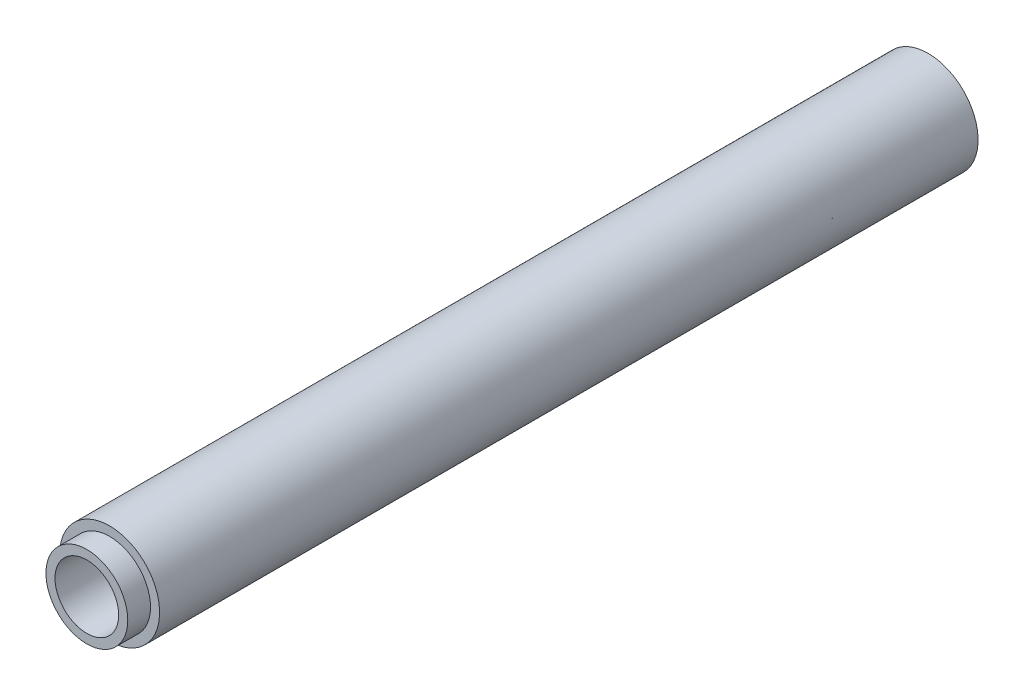
ISO-10303-21;
HEADER;
FILE_DESCRIPTION(('STEP AP214'),'2;1');
FILE_NAME('part.step','',(''),(''),'','','');
FILE_SCHEMA(('AUTOMOTIVE_DESIGN { 1 0 10303 214 1 1 1 1 }'));
ENDSEC;
DATA;
#1=APPLICATION_CONTEXT('core data for automotive mechanical design processes');
#2=APPLICATION_PROTOCOL_DEFINITION('international standard','automotive_design',2000,#1);
#3=PRODUCT_CONTEXT('',#1,'mechanical');
#4=PRODUCT('Part','Part','',(#3));
#5=PRODUCT_RELATED_PRODUCT_CATEGORY('part','',(#4));
#6=PRODUCT_DEFINITION_FORMATION('','',#4);
#7=PRODUCT_DEFINITION_CONTEXT('part definition',#1,'design');
#8=PRODUCT_DEFINITION('design','',#6,#7);
#9=PRODUCT_DEFINITION_SHAPE('','',#8);
#10=(LENGTH_UNIT() NAMED_UNIT(*) SI_UNIT(.MILLI.,.METRE.));
#11=(NAMED_UNIT(*) PLANE_ANGLE_UNIT() SI_UNIT($,.RADIAN.));
#12=(NAMED_UNIT(*) SI_UNIT($,.STERADIAN.) SOLID_ANGLE_UNIT());
#13=UNCERTAINTY_MEASURE_WITH_UNIT(LENGTH_MEASURE(1.E-05),#10,'distance_accuracy_value','');
#14=(GEOMETRIC_REPRESENTATION_CONTEXT(3) GLOBAL_UNCERTAINTY_ASSIGNED_CONTEXT((#13)) GLOBAL_UNIT_ASSIGNED_CONTEXT((#10,
#11,#12)) REPRESENTATION_CONTEXT('',''));
#15=CARTESIAN_POINT('',(0.,0.,0.));
#16=DIRECTION('',(0.,0.,1.));
#17=DIRECTION('',(1.,0.,0.));
#18=AXIS2_PLACEMENT_3D('',#15,#16,#17);
#19=CARTESIAN_POINT('',(0.,0.,180.));
#20=DIRECTION('',(0.,0.,-1.));
#21=DIRECTION('',(-1.,0.,0.));
#22=AXIS2_PLACEMENT_3D('',#19,#20,#21);
#23=CYLINDRICAL_SURFACE('',#22,11.);
#24=CARTESIAN_POINT('',(0.,0.,180.));
#25=DIRECTION('',(0.,0.,1.));
#26=DIRECTION('',(1.,0.,0.));
#27=AXIS2_PLACEMENT_3D('',#24,#25,#26);
#28=CIRCLE('',#27,11.);
#29=CARTESIAN_POINT('',(-11.,0.,180.));
#30=VERTEX_POINT('',#29);
#31=EDGE_CURVE('E58',#30,#30,#28,.T.);
#32=CARTESIAN_POINT('',(0.,0.,0.));
#33=DIRECTION('',(0.,0.,1.));
#34=DIRECTION('',(1.,0.,0.));
#35=AXIS2_PLACEMENT_3D('',#32,#33,#34);
#36=CIRCLE('',#35,11.);
#37=CARTESIAN_POINT('',(-11.,0.,0.));
#38=VERTEX_POINT('',#37);
#39=EDGE_CURVE('E54',#38,#38,#36,.T.);
#40=CARTESIAN_POINT('',(-11.,0.,180.));
#41=CARTESIAN_POINT('',(-11.,0.,178.125));
#42=CARTESIAN_POINT('',(-11.,0.,176.25));
#43=CARTESIAN_POINT('',(-11.,0.,172.5));
#44=CARTESIAN_POINT('',(-11.,0.,170.625));
#45=CARTESIAN_POINT('',(-11.,0.,166.875));
#46=CARTESIAN_POINT('',(-11.,0.,165.));
#47=CARTESIAN_POINT('',(-11.,0.,161.25));
#48=CARTESIAN_POINT('',(-11.,0.,159.375));
#49=CARTESIAN_POINT('',(-11.,0.,155.625));
#50=CARTESIAN_POINT('',(-11.,0.,153.75));
#51=CARTESIAN_POINT('',(-11.,0.,150.));
#52=CARTESIAN_POINT('',(-11.,0.,148.125));
#53=CARTESIAN_POINT('',(-11.,0.,144.375));
#54=CARTESIAN_POINT('',(-11.,0.,142.5));
#55=CARTESIAN_POINT('',(-11.,0.,138.75));
#56=CARTESIAN_POINT('',(-11.,0.,136.875));
#57=CARTESIAN_POINT('',(-11.,0.,133.125));
#58=CARTESIAN_POINT('',(-11.,0.,131.25));
#59=CARTESIAN_POINT('',(-11.,0.,127.5));
#60=CARTESIAN_POINT('',(-11.,0.,125.625));
#61=CARTESIAN_POINT('',(-11.,0.,121.875));
#62=CARTESIAN_POINT('',(-11.,0.,120.));
#63=CARTESIAN_POINT('',(-11.,0.,116.25));
#64=CARTESIAN_POINT('',(-11.,0.,114.375));
#65=CARTESIAN_POINT('',(-11.,0.,110.625));
#66=CARTESIAN_POINT('',(-11.,0.,108.75));
#67=CARTESIAN_POINT('',(-11.,0.,105.));
#68=CARTESIAN_POINT('',(-11.,0.,103.125));
#69=CARTESIAN_POINT('',(-11.,0.,99.375));
#70=CARTESIAN_POINT('',(-11.,0.,97.5));
#71=CARTESIAN_POINT('',(-11.,0.,93.75));
#72=CARTESIAN_POINT('',(-11.,0.,91.875));
#73=CARTESIAN_POINT('',(-11.,0.,88.125));
#74=CARTESIAN_POINT('',(-11.,0.,86.25));
#75=CARTESIAN_POINT('',(-11.,0.,82.5));
#76=CARTESIAN_POINT('',(-11.,0.,80.625));
#77=CARTESIAN_POINT('',(-11.,0.,76.875));
#78=CARTESIAN_POINT('',(-11.,0.,75.));
#79=CARTESIAN_POINT('',(-11.,0.,71.25));
#80=CARTESIAN_POINT('',(-11.,0.,69.375));
#81=CARTESIAN_POINT('',(-11.,0.,65.625));
#82=CARTESIAN_POINT('',(-11.,0.,63.75));
#83=CARTESIAN_POINT('',(-11.,0.,60.));
#84=CARTESIAN_POINT('',(-11.,0.,58.125));
#85=CARTESIAN_POINT('',(-11.,0.,54.375));
#86=CARTESIAN_POINT('',(-11.,0.,52.5));
#87=CARTESIAN_POINT('',(-11.,0.,48.75));
#88=CARTESIAN_POINT('',(-11.,0.,46.875));
#89=CARTESIAN_POINT('',(-11.,0.,43.125));
#90=CARTESIAN_POINT('',(-11.,0.,41.25));
#91=CARTESIAN_POINT('',(-11.,0.,37.5));
#92=CARTESIAN_POINT('',(-11.,0.,35.625));
#93=CARTESIAN_POINT('',(-11.,0.,31.875));
#94=CARTESIAN_POINT('',(-11.,0.,30.));
#95=CARTESIAN_POINT('',(-11.,0.,26.25));
#96=CARTESIAN_POINT('',(-11.,0.,24.375));
#97=CARTESIAN_POINT('',(-11.,0.,20.625));
#98=CARTESIAN_POINT('',(-11.,0.,18.75));
#99=CARTESIAN_POINT('',(-11.,0.,15.));
#100=CARTESIAN_POINT('',(-11.,0.,13.125));
#101=CARTESIAN_POINT('',(-11.,0.,9.37499999999998));
#102=CARTESIAN_POINT('',(-11.,0.,7.49999999999997));
#103=CARTESIAN_POINT('',(-11.,0.,3.74999999999997));
#104=CARTESIAN_POINT('',(-11.,0.,1.87499999999997));
#105=CARTESIAN_POINT('',(-11.,0.,0.));
#106=B_SPLINE_CURVE_WITH_KNOTS('',3,(#40,#41,#42,#43,#44,#45,#46,#47,#48,#49,#50,#51,#52,#53,
#54,#55,#56,#57,#58,#59,#60,#61,#62,#63,#64,#65,#66,#67,#68,#69,#70,#71,#72,#73,#74,#75,#76,#77,
#78,#79,#80,#81,#82,#83,#84,#85,#86,#87,#88,#89,#90,#91,#92,#93,#94,#95,#96,#97,#98,#99,#100,
#101,#102,#103,#104,#105),.UNSPECIFIED.,.F.,.F.,(4,2,2,2,2,2,2,2,2,2,2,2,2,2,2,2,2,2,2,2,2,2,2,
2,2,2,2,2,2,2,2,2,4),(0.,5.62500000000002,11.25,16.875,22.5,28.125,33.75,39.375,45.,50.625,
56.25,61.875,67.5,73.125,78.75,84.375,90.,95.625,101.25,106.875,112.5,118.125,123.75,129.375,
135.,140.625,146.25,151.875,157.5,163.125,168.75,174.375,180.),.UNSPECIFIED.);
#107=EDGE_CURVE('BSEAM51',#30,#38,#106,.T.);
#108=ORIENTED_EDGE('',*,*,#31,.F.);
#109=ORIENTED_EDGE('',*,*,#39,.T.);
#110=ORIENTED_EDGE('',*,*,#107,.T.);
#111=ORIENTED_EDGE('',*,*,#107,.F.);
#112=EDGE_LOOP('',(#108,#110,#109,#111));
#113=FACE_BOUND('',#112,.T.);
#114=ADVANCED_FACE('F51',(#113),#23,.T.);
#115=CARTESIAN_POINT('',(0.,0.,180.));
#116=DIRECTION('',(0.,0.,1.));
#117=DIRECTION('',(1.,0.,0.));
#118=AXIS2_PLACEMENT_3D('',#115,#116,#117);
#119=PLANE('',#118);
#120=CARTESIAN_POINT('',(0.,0.,180.));
#121=DIRECTION('',(0.,0.,1.));
#122=DIRECTION('',(1.,0.,0.));
#123=AXIS2_PLACEMENT_3D('',#120,#121,#122);
#124=CIRCLE('',#123,9.);
#125=CARTESIAN_POINT('',(9.,0.,180.));
#126=VERTEX_POINT('',#125);
#127=EDGE_CURVE('E12',#126,#126,#124,.T.);
#128=ORIENTED_EDGE('',*,*,#127,.F.);
#129=EDGE_LOOP('',(#128));
#130=FACE_BOUND('',#129,.T.);
#131=ORIENTED_EDGE('',*,*,#31,.T.);
#132=EDGE_LOOP('',(#131));
#133=FACE_BOUND('',#132,.T.);
#134=ADVANCED_FACE('F87',(#130,#133),#119,.T.);
#135=CARTESIAN_POINT('',(0.,0.,0.));
#136=DIRECTION('',(0.,0.,1.));
#137=DIRECTION('',(1.,0.,0.));
#138=AXIS2_PLACEMENT_3D('',#135,#136,#137);
#139=PLANE('',#138);
#140=CARTESIAN_POINT('',(0.,0.,0.));
#141=DIRECTION('',(0.,0.,1.));
#142=DIRECTION('',(1.,0.,0.));
#143=AXIS2_PLACEMENT_3D('',#140,#141,#142);
#144=CIRCLE('',#143,7.);
#145=CARTESIAN_POINT('',(7.,0.,0.));
#146=VERTEX_POINT('',#145);
#147=EDGE_CURVE('E67',#146,#146,#144,.T.);
#148=ORIENTED_EDGE('',*,*,#147,.T.);
#149=EDGE_LOOP('',(#148));
#150=FACE_BOUND('',#149,.T.);
#151=ORIENTED_EDGE('',*,*,#39,.F.);
#152=EDGE_LOOP('',(#151));
#153=FACE_BOUND('',#152,.T.);
#154=ADVANCED_FACE('F83',(#150,#153),#139,.F.);
#155=CARTESIAN_POINT('',(0.,0.,185.));
#156=DIRECTION('',(0.,0.,-1.));
#157=DIRECTION('',(-1.,0.,0.));
#158=AXIS2_PLACEMENT_3D('',#155,#156,#157);
#159=CYLINDRICAL_SURFACE('',#158,9.);
#160=CARTESIAN_POINT('',(0.,0.,185.));
#161=DIRECTION('',(0.,0.,1.));
#162=DIRECTION('',(1.,0.,0.));
#163=AXIS2_PLACEMENT_3D('',#160,#161,#162);
#164=CIRCLE('',#163,9.);
#165=CARTESIAN_POINT('',(9.,0.,185.));
#166=VERTEX_POINT('',#165);
#167=EDGE_CURVE('E64',#166,#166,#164,.T.);
#168=ORIENTED_EDGE('',*,*,#167,.F.);
#169=EDGE_LOOP('',(#168));
#170=FACE_BOUND('',#169,.T.);
#171=ORIENTED_EDGE('',*,*,#127,.T.);
#172=EDGE_LOOP('',(#171));
#173=FACE_BOUND('',#172,.T.);
#174=ADVANCED_FACE('F86',(#170,#173),#159,.T.);
#175=CARTESIAN_POINT('',(0.,0.,185.));
#176=DIRECTION('',(0.,0.,1.));
#177=DIRECTION('',(1.,0.,0.));
#178=AXIS2_PLACEMENT_3D('',#175,#176,#177);
#179=PLANE('',#178);
#180=CARTESIAN_POINT('',(0.,0.,185.));
#181=DIRECTION('',(0.,0.,-1.));
#182=DIRECTION('',(-1.,0.,0.));
#183=AXIS2_PLACEMENT_3D('',#180,#181,#182);
#184=CIRCLE('',#183,7.);
#185=CARTESIAN_POINT('',(-7.,0.,185.));
#186=VERTEX_POINT('',#185);
#187=EDGE_CURVE('E70',#186,#186,#184,.T.);
#188=ORIENTED_EDGE('',*,*,#187,.T.);
#189=EDGE_LOOP('',(#188));
#190=FACE_BOUND('',#189,.T.);
#191=ORIENTED_EDGE('',*,*,#167,.T.);
#192=EDGE_LOOP('',(#191));
#193=FACE_BOUND('',#192,.T.);
#194=ADVANCED_FACE('F74',(#190,#193),#179,.T.);
#195=CARTESIAN_POINT('',(0.,0.,185.));
#196=DIRECTION('',(0.,0.,-1.));
#197=DIRECTION('',(-1.,0.,0.));
#198=AXIS2_PLACEMENT_3D('',#195,#196,#197);
#199=CYLINDRICAL_SURFACE('',#198,7.);
#200=ORIENTED_EDGE('',*,*,#187,.F.);
#201=EDGE_LOOP('',(#200));
#202=FACE_BOUND('',#201,.T.);
#203=ORIENTED_EDGE('',*,*,#147,.F.);
#204=EDGE_LOOP('',(#203));
#205=FACE_BOUND('',#204,.T.);
#206=ADVANCED_FACE('F77',(#202,#205),#199,.F.);
#207=CLOSED_SHELL('',(#114,#134,#154,#174,#194,#206));
#208=MANIFOLD_SOLID_BREP('B2',#207);
#209=ADVANCED_BREP_SHAPE_REPRESENTATION('',(#18,#208),#14);
#210=SHAPE_DEFINITION_REPRESENTATION(#9,#209);
ENDSEC;
END-ISO-10303-21;
